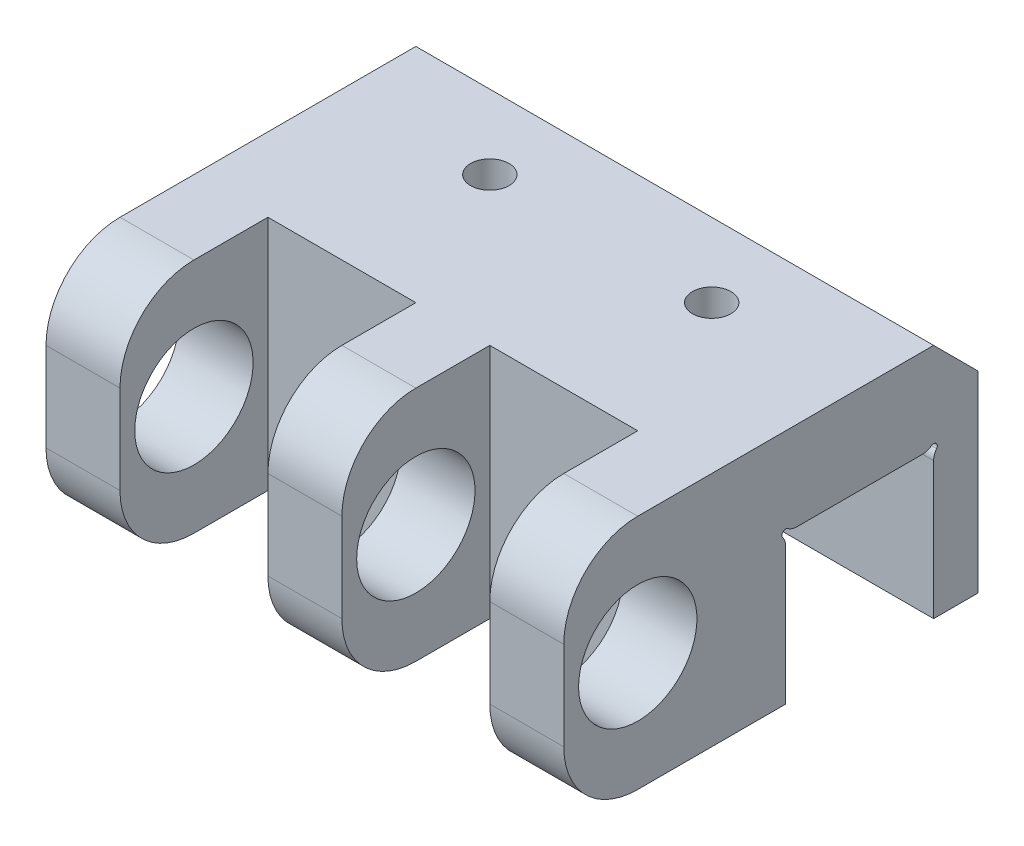
ISO-10303-21;
HEADER;
FILE_DESCRIPTION(('STEP AP214'),'2;1');
FILE_NAME('part.step','',(''),(''),'','','');
FILE_SCHEMA(('AUTOMOTIVE_DESIGN { 1 0 10303 214 1 1 1 1 }'));
ENDSEC;
DATA;
#1=APPLICATION_CONTEXT('core data for automotive mechanical design processes');
#2=APPLICATION_PROTOCOL_DEFINITION('international standard','automotive_design',2000,#1);
#3=PRODUCT_CONTEXT('',#1,'mechanical');
#4=PRODUCT('Part','Part','',(#3));
#5=PRODUCT_RELATED_PRODUCT_CATEGORY('part','',(#4));
#6=PRODUCT_DEFINITION_FORMATION('','',#4);
#7=PRODUCT_DEFINITION_CONTEXT('part definition',#1,'design');
#8=PRODUCT_DEFINITION('design','',#6,#7);
#9=PRODUCT_DEFINITION_SHAPE('','',#8);
#10=(LENGTH_UNIT() NAMED_UNIT(*) SI_UNIT(.MILLI.,.METRE.));
#11=(NAMED_UNIT(*) PLANE_ANGLE_UNIT() SI_UNIT($,.RADIAN.));
#12=(NAMED_UNIT(*) SI_UNIT($,.STERADIAN.) SOLID_ANGLE_UNIT());
#13=UNCERTAINTY_MEASURE_WITH_UNIT(LENGTH_MEASURE(1.E-05),#10,'distance_accuracy_value','');
#14=(GEOMETRIC_REPRESENTATION_CONTEXT(3) GLOBAL_UNCERTAINTY_ASSIGNED_CONTEXT((#13)) GLOBAL_UNIT_ASSIGNED_CONTEXT((#10,
#11,#12)) REPRESENTATION_CONTEXT('',''));
#15=CARTESIAN_POINT('',(0.,0.,0.));
#16=DIRECTION('',(0.,0.,1.));
#17=DIRECTION('',(1.,0.,0.));
#18=AXIS2_PLACEMENT_3D('',#15,#16,#17);
#19=CARTESIAN_POINT('',(70.,20.,-26.));
#20=DIRECTION('',(0.,1.,0.));
#21=DIRECTION('',(0.,0.,1.));
#22=AXIS2_PLACEMENT_3D('',#19,#20,#21);
#23=PLANE('',#22);
#24=CARTESIAN_POINT('',(20.,20.,-10.));
#25=DIRECTION('',(0.,-1.,0.));
#26=DIRECTION('',(0.,0.,-1.));
#27=AXIS2_PLACEMENT_3D('',#24,#25,#26);
#28=CIRCLE('',#27,2.6);
#29=CARTESIAN_POINT('',(20.,20.,-12.6));
#30=VERTEX_POINT('',#29);
#31=EDGE_CURVE('E1016',#30,#30,#28,.T.);
#32=ORIENTED_EDGE('',*,*,#31,.F.);
#33=EDGE_LOOP('',(#32));
#34=FACE_BOUND('',#33,.T.);
#35=CARTESIAN_POINT('',(50.,20.,-10.));
#36=DIRECTION('',(0.,-1.,0.));
#37=DIRECTION('',(0.,0.,-1.));
#38=AXIS2_PLACEMENT_3D('',#35,#36,#37);
#39=CIRCLE('',#38,2.6);
#40=CARTESIAN_POINT('',(50.,20.,-12.6));
#41=VERTEX_POINT('',#40);
#42=EDGE_CURVE('E1012',#41,#41,#39,.T.);
#43=ORIENTED_EDGE('',*,*,#42,.F.);
#44=EDGE_LOOP('',(#43));
#45=FACE_BOUND('',#44,.T.);
#46=DIRECTION('',(0.,0.,1.));
#47=VECTOR('',#46,1.);
#48=CARTESIAN_POINT('',(70.,20.,-26.));
#49=LINE('',#48,#47);
#50=CARTESIAN_POINT('',(70.,20.,-18.5));
#51=VERTEX_POINT('',#50);
#52=CARTESIAN_POINT('',(70.,20.,-1.50000000000001));
#53=VERTEX_POINT('',#52);
#54=EDGE_CURVE('E293',#51,#53,#49,.T.);
#55=ORIENTED_EDGE('',*,*,#54,.T.);
#56=DIRECTION('',(-1.,0.,0.));
#57=VECTOR('',#56,1.);
#58=CARTESIAN_POINT('',(70.,20.,-1.5));
#59=LINE('',#58,#57);
#60=CARTESIAN_POINT('',(0.,20.,-1.50000000000001));
#61=VERTEX_POINT('',#60);
#62=EDGE_CURVE('E433',#53,#61,#59,.T.);
#63=ORIENTED_EDGE('',*,*,#62,.T.);
#64=DIRECTION('',(0.,0.,1.));
#65=VECTOR('',#64,1.);
#66=CARTESIAN_POINT('',(0.,20.,-26.));
#67=LINE('',#66,#65);
#68=CARTESIAN_POINT('',(0.,20.,-18.5));
#69=VERTEX_POINT('',#68);
#70=EDGE_CURVE('E251',#69,#61,#67,.T.);
#71=ORIENTED_EDGE('',*,*,#70,.F.);
#72=DIRECTION('',(-1.,0.,0.));
#73=VECTOR('',#72,1.);
#74=CARTESIAN_POINT('',(70.,20.,-18.5));
#75=LINE('',#74,#73);
#76=EDGE_CURVE('E429',#69,#51,#75,.F.);
#77=ORIENTED_EDGE('',*,*,#76,.T.);
#78=EDGE_LOOP('',(#55,#63,#71,#77));
#79=FACE_BOUND('',#78,.T.);
#80=ADVANCED_FACE('F47',(#34,#45,#79),#23,.F.);
#81=CARTESIAN_POINT('',(0.,0.,10.));
#82=DIRECTION('',(0.,0.,-1.));
#83=DIRECTION('',(-1.,0.,0.));
#84=AXIS2_PLACEMENT_3D('',#81,#82,#83);
#85=PLANE('',#84);
#86=DIRECTION('',(0.,-1.,0.));
#87=VECTOR('',#86,1.);
#88=CARTESIAN_POINT('',(60.,32.,10.));
#89=LINE('',#88,#87);
#90=CARTESIAN_POINT('',(60.,32.,10.));
#91=VERTEX_POINT('',#90);
#92=CARTESIAN_POINT('',(60.,0.,10.));
#93=VERTEX_POINT('',#92);
#94=EDGE_CURVE('E304',#91,#93,#89,.T.);
#95=ORIENTED_EDGE('',*,*,#94,.F.);
#96=DIRECTION('',(-1.,0.,0.));
#97=VECTOR('',#96,1.);
#98=CARTESIAN_POINT('',(0.,32.,10.));
#99=LINE('',#98,#97);
#100=CARTESIAN_POINT('',(40.,32.,10.));
#101=VERTEX_POINT('',#100);
#102=EDGE_CURVE('E368',#91,#101,#99,.T.);
#103=ORIENTED_EDGE('',*,*,#102,.T.);
#104=DIRECTION('',(0.,1.,0.));
#105=VECTOR('',#104,1.);
#106=CARTESIAN_POINT('',(40.,0.,10.));
#107=LINE('',#106,#105);
#108=CARTESIAN_POINT('',(40.,0.,10.));
#109=VERTEX_POINT('',#108);
#110=EDGE_CURVE('E328',#109,#101,#107,.T.);
#111=ORIENTED_EDGE('',*,*,#110,.F.);
#112=DIRECTION('',(1.,0.,0.));
#113=VECTOR('',#112,1.);
#114=CARTESIAN_POINT('',(0.,0.,10.));
#115=LINE('',#114,#113);
#116=EDGE_CURVE('E367',#109,#93,#115,.T.);
#117=ORIENTED_EDGE('',*,*,#116,.T.);
#118=EDGE_LOOP('',(#95,#103,#111,#117));
#119=FACE_BOUND('',#118,.T.);
#120=ADVANCED_FACE('F550',(#119),#85,.F.);
#121=DIRECTION('',(0.,-1.,0.));
#122=VECTOR('',#121,1.);
#123=CARTESIAN_POINT('',(30.,0.,10.));
#124=LINE('',#123,#122);
#125=CARTESIAN_POINT('',(30.,32.,10.));
#126=VERTEX_POINT('',#125);
#127=CARTESIAN_POINT('',(30.,0.,10.));
#128=VERTEX_POINT('',#127);
#129=EDGE_CURVE('E332',#126,#128,#124,.T.);
#130=ORIENTED_EDGE('',*,*,#129,.F.);
#131=CARTESIAN_POINT('',(10.,32.,10.));
#132=VERTEX_POINT('',#131);
#133=EDGE_CURVE('E366',#126,#132,#99,.T.);
#134=ORIENTED_EDGE('',*,*,#133,.T.);
#135=DIRECTION('',(0.,1.,0.));
#136=VECTOR('',#135,1.);
#137=CARTESIAN_POINT('',(10.,32.,10.));
#138=LINE('',#137,#136);
#139=CARTESIAN_POINT('',(10.,0.,10.));
#140=VERTEX_POINT('',#139);
#141=EDGE_CURVE('E337',#140,#132,#138,.T.);
#142=ORIENTED_EDGE('',*,*,#141,.F.);
#143=EDGE_CURVE('E362',#140,#128,#115,.T.);
#144=ORIENTED_EDGE('',*,*,#143,.T.);
#145=EDGE_LOOP('',(#130,#134,#142,#144));
#146=FACE_BOUND('',#145,.T.);
#147=ADVANCED_FACE('F590',(#146),#85,.F.);
#148=CARTESIAN_POINT('',(0.,0.,10.));
#149=DIRECTION('',(1.,0.,0.));
#150=DIRECTION('',(0.,0.,-1.));
#151=AXIS2_PLACEMENT_3D('',#148,#149,#150);
#152=PLANE('',#151);
#153=CARTESIAN_POINT('',(0.,16.,20.));
#154=DIRECTION('',(-1.,0.,0.));
#155=DIRECTION('',(0.,0.,1.));
#156=AXIS2_PLACEMENT_3D('',#153,#154,#155);
#157=CIRCLE('',#156,8.);
#158=CARTESIAN_POINT('',(0.,16.,28.));
#159=VERTEX_POINT('',#158);
#160=EDGE_CURVE('E1001',#159,#159,#157,.T.);
#161=ORIENTED_EDGE('',*,*,#160,.F.);
#162=EDGE_LOOP('',(#161));
#163=FACE_BOUND('',#162,.T.);
#164=DIRECTION('',(0.,0.,-1.));
#165=VECTOR('',#164,1.);
#166=CARTESIAN_POINT('',(0.,32.,10.));
#167=LINE('',#166,#165);
#168=CARTESIAN_POINT('',(0.,32.,20.));
#169=VERTEX_POINT('',#168);
#170=CARTESIAN_POINT('',(0.,32.,-20.));
#171=VERTEX_POINT('',#170);
#172=EDGE_CURVE('E372',#169,#171,#167,.T.);
#173=ORIENTED_EDGE('',*,*,#172,.T.);
#174=DIRECTION('',(0.,-0.707106781186546,-0.707106781186549));
#175=VECTOR('',#174,1.);
#176=CARTESIAN_POINT('',(0.,26.,-26.));
#177=LINE('',#176,#175);
#178=CARTESIAN_POINT('',(0.,26.,-26.));
#179=VERTEX_POINT('',#178);
#180=EDGE_CURVE('E11',#171,#179,#177,.T.);
#181=ORIENTED_EDGE('',*,*,#180,.T.);
#182=DIRECTION('',(0.,1.,0.));
#183=VECTOR('',#182,1.);
#184=CARTESIAN_POINT('',(0.,32.,-26.));
#185=LINE('',#184,#183);
#186=CARTESIAN_POINT('',(0.,0.,-26.));
#187=VERTEX_POINT('',#186);
#188=EDGE_CURVE('E240',#187,#179,#185,.T.);
#189=ORIENTED_EDGE('',*,*,#188,.F.);
#190=DIRECTION('',(0.,0.,-1.));
#191=VECTOR('',#190,1.);
#192=CARTESIAN_POINT('',(0.,0.,-26.));
#193=LINE('',#192,#191);
#194=CARTESIAN_POINT('',(0.,0.,-20.));
#195=VERTEX_POINT('',#194);
#196=EDGE_CURVE('E245',#195,#187,#193,.T.);
#197=ORIENTED_EDGE('',*,*,#196,.F.);
#198=DIRECTION('',(0.,1.,0.));
#199=VECTOR('',#198,1.);
#200=CARTESIAN_POINT('',(0.,0.,-20.));
#201=LINE('',#200,#199);
#202=CARTESIAN_POINT('',(0.,18.5,-20.));
#203=VERTEX_POINT('',#202);
#204=EDGE_CURVE('E281',#195,#203,#201,.T.);
#205=ORIENTED_EDGE('',*,*,#204,.T.);
#206=CARTESIAN_POINT('',(0.,18.5,-22.));
#207=DIRECTION('',(1.,0.,0.));
#208=DIRECTION('',(0.,0.,-1.));
#209=AXIS2_PLACEMENT_3D('',#206,#207,#208);
#210=CIRCLE('',#209,2.);
#211=CARTESIAN_POINT('',(0.,19.7,-20.4));
#212=VERTEX_POINT('',#211);
#213=EDGE_CURVE('E402',#203,#212,#210,.F.);
#214=ORIENTED_EDGE('',*,*,#213,.T.);
#215=CARTESIAN_POINT('',(0.,20.,-20.));
#216=DIRECTION('',(-1.,0.,0.));
#217=DIRECTION('',(0.,0.,1.));
#218=AXIS2_PLACEMENT_3D('',#215,#216,#217);
#219=CIRCLE('',#218,0.499999999999999);
#220=CARTESIAN_POINT('',(0.,20.4,-19.7));
#221=VERTEX_POINT('',#220);
#222=EDGE_CURVE('E271',#221,#212,#219,.T.);
#223=ORIENTED_EDGE('',*,*,#222,.F.);
#224=CARTESIAN_POINT('',(0.,22.,-18.5));
#225=DIRECTION('',(1.,0.,0.));
#226=DIRECTION('',(0.,0.,-1.));
#227=AXIS2_PLACEMENT_3D('',#224,#225,#226);
#228=CIRCLE('',#227,2.);
#229=EDGE_CURVE('E405',#221,#69,#228,.F.);
#230=ORIENTED_EDGE('',*,*,#229,.T.);
#231=ORIENTED_EDGE('',*,*,#70,.T.);
#232=CARTESIAN_POINT('',(0.,22.,-1.5));
#233=DIRECTION('',(1.,0.,0.));
#234=DIRECTION('',(0.,0.,-1.));
#235=AXIS2_PLACEMENT_3D('',#232,#233,#234);
#236=CIRCLE('',#235,2.);
#237=CARTESIAN_POINT('',(0.,20.4,-0.299999999999999));
#238=VERTEX_POINT('',#237);
#239=EDGE_CURVE('E408',#61,#238,#236,.F.);
#240=ORIENTED_EDGE('',*,*,#239,.T.);
#241=CARTESIAN_POINT('',(0.,20.,0.));
#242=DIRECTION('',(-1.,0.,0.));
#243=DIRECTION('',(0.,0.,1.));
#244=AXIS2_PLACEMENT_3D('',#241,#242,#243);
#245=CIRCLE('',#244,0.5);
#246=CARTESIAN_POINT('',(0.,19.7,0.399999999999999));
#247=VERTEX_POINT('',#246);
#248=EDGE_CURVE('E986',#247,#238,#245,.T.);
#249=ORIENTED_EDGE('',*,*,#248,.F.);
#250=CARTESIAN_POINT('',(0.,18.5,2.));
#251=DIRECTION('',(1.,0.,0.));
#252=DIRECTION('',(0.,0.,-1.));
#253=AXIS2_PLACEMENT_3D('',#250,#251,#252);
#254=CIRCLE('',#253,2.);
#255=CARTESIAN_POINT('',(0.,18.5,0.));
#256=VERTEX_POINT('',#255);
#257=EDGE_CURVE('E411',#247,#256,#254,.F.);
#258=ORIENTED_EDGE('',*,*,#257,.T.);
#259=DIRECTION('',(0.,-1.,0.));
#260=VECTOR('',#259,1.);
#261=CARTESIAN_POINT('',(0.,0.,0.));
#262=LINE('',#261,#260);
#263=CARTESIAN_POINT('',(0.,0.,0.));
#264=VERTEX_POINT('',#263);
#265=EDGE_CURVE('E361',#256,#264,#262,.T.);
#266=ORIENTED_EDGE('',*,*,#265,.T.);
#267=DIRECTION('',(0.,0.,-1.));
#268=VECTOR('',#267,1.);
#269=CARTESIAN_POINT('',(0.,0.,10.));
#270=LINE('',#269,#268);
#271=CARTESIAN_POINT('',(0.,0.,20.));
#272=VERTEX_POINT('',#271);
#273=EDGE_CURVE('E392',#272,#264,#270,.T.);
#274=ORIENTED_EDGE('',*,*,#273,.F.);
#275=CARTESIAN_POINT('',(0.,10.,20.));
#276=DIRECTION('',(1.,0.,0.));
#277=DIRECTION('',(0.,0.,-1.));
#278=AXIS2_PLACEMENT_3D('',#275,#276,#277);
#279=CIRCLE('',#278,10.);
#280=CARTESIAN_POINT('',(0.,10.,30.));
#281=VERTEX_POINT('',#280);
#282=EDGE_CURVE('E479',#272,#281,#279,.F.);
#283=ORIENTED_EDGE('',*,*,#282,.T.);
#284=DIRECTION('',(0.,-1.,0.));
#285=VECTOR('',#284,1.);
#286=CARTESIAN_POINT('',(0.,32.,30.));
#287=LINE('',#286,#285);
#288=CARTESIAN_POINT('',(0.,22.,30.));
#289=VERTEX_POINT('',#288);
#290=EDGE_CURVE('E344',#289,#281,#287,.T.);
#291=ORIENTED_EDGE('',*,*,#290,.F.);
#292=CARTESIAN_POINT('',(0.,22.,20.));
#293=DIRECTION('',(1.,0.,0.));
#294=DIRECTION('',(0.,0.,-1.));
#295=AXIS2_PLACEMENT_3D('',#292,#293,#294);
#296=CIRCLE('',#295,10.);
#297=EDGE_CURVE('E476',#289,#169,#296,.F.);
#298=ORIENTED_EDGE('',*,*,#297,.T.);
#299=EDGE_LOOP('',(#173,#181,#189,#197,#205,#214,#223,#230,#231,#240,#249,#258,#266,#274,#283,
#291,#298));
#300=FACE_BOUND('',#299,.T.);
#301=ADVANCED_FACE('F242',(#163,#300),#152,.F.);
#302=CARTESIAN_POINT('',(0.,0.,10.));
#303=DIRECTION('',(0.,1.,0.));
#304=DIRECTION('',(0.,0.,1.));
#305=AXIS2_PLACEMENT_3D('',#302,#303,#304);
#306=PLANE('',#305);
#307=DIRECTION('',(0.,0.,-1.));
#308=VECTOR('',#307,1.);
#309=CARTESIAN_POINT('',(10.,0.,30.));
#310=LINE('',#309,#308);
#311=CARTESIAN_POINT('',(10.,0.,20.));
#312=VERTEX_POINT('',#311);
#313=EDGE_CURVE('E358',#312,#140,#310,.T.);
#314=ORIENTED_EDGE('',*,*,#313,.F.);
#315=DIRECTION('',(1.,0.,0.));
#316=VECTOR('',#315,1.);
#317=CARTESIAN_POINT('',(0.,0.,20.));
#318=LINE('',#317,#316);
#319=EDGE_CURVE('E473',#312,#272,#318,.F.);
#320=ORIENTED_EDGE('',*,*,#319,.T.);
#321=ORIENTED_EDGE('',*,*,#273,.T.);
#322=DIRECTION('',(1.,0.,0.));
#323=VECTOR('',#322,1.);
#324=CARTESIAN_POINT('',(0.,0.,0.));
#325=LINE('',#324,#323);
#326=CARTESIAN_POINT('',(70.,0.,0.));
#327=VERTEX_POINT('',#326);
#328=EDGE_CURVE('E376',#264,#327,#325,.T.);
#329=ORIENTED_EDGE('',*,*,#328,.T.);
#330=DIRECTION('',(0.,0.,-1.));
#331=VECTOR('',#330,1.);
#332=CARTESIAN_POINT('',(70.,0.,10.));
#333=LINE('',#332,#331);
#334=CARTESIAN_POINT('',(70.,0.,20.));
#335=VERTEX_POINT('',#334);
#336=EDGE_CURVE('E389',#335,#327,#333,.T.);
#337=ORIENTED_EDGE('',*,*,#336,.F.);
#338=DIRECTION('',(1.,0.,0.));
#339=VECTOR('',#338,1.);
#340=CARTESIAN_POINT('',(0.,0.,20.));
#341=LINE('',#340,#339);
#342=CARTESIAN_POINT('',(60.,0.,20.));
#343=VERTEX_POINT('',#342);
#344=EDGE_CURVE('E467',#335,#343,#341,.F.);
#345=ORIENTED_EDGE('',*,*,#344,.T.);
#346=DIRECTION('',(0.,0.,-1.));
#347=VECTOR('',#346,1.);
#348=CARTESIAN_POINT('',(60.,0.,30.));
#349=LINE('',#348,#347);
#350=EDGE_CURVE('E300',#343,#93,#349,.T.);
#351=ORIENTED_EDGE('',*,*,#350,.T.);
#352=ORIENTED_EDGE('',*,*,#116,.F.);
#353=DIRECTION('',(0.,0.,-1.));
#354=VECTOR('',#353,1.);
#355=CARTESIAN_POINT('',(40.,0.,30.));
#356=LINE('',#355,#354);
#357=CARTESIAN_POINT('',(40.,0.,20.));
#358=VERTEX_POINT('',#357);
#359=EDGE_CURVE('E318',#358,#109,#356,.T.);
#360=ORIENTED_EDGE('',*,*,#359,.F.);
#361=DIRECTION('',(1.,0.,0.));
#362=VECTOR('',#361,1.);
#363=CARTESIAN_POINT('',(0.,0.,20.));
#364=LINE('',#363,#362);
#365=CARTESIAN_POINT('',(30.,0.,20.));
#366=VERTEX_POINT('',#365);
#367=EDGE_CURVE('E470',#358,#366,#364,.F.);
#368=ORIENTED_EDGE('',*,*,#367,.T.);
#369=DIRECTION('',(0.,0.,-1.));
#370=VECTOR('',#369,1.);
#371=CARTESIAN_POINT('',(30.,0.,30.));
#372=LINE('',#371,#370);
#373=EDGE_CURVE('E308',#366,#128,#372,.T.);
#374=ORIENTED_EDGE('',*,*,#373,.T.);
#375=ORIENTED_EDGE('',*,*,#143,.F.);
#376=EDGE_LOOP('',(#314,#320,#321,#329,#337,#345,#351,#352,#360,#368,#374,#375));
#377=FACE_BOUND('',#376,.T.);
#378=ADVANCED_FACE('F569',(#377),#306,.F.);
#379=CARTESIAN_POINT('',(70.,0.,10.));
#380=DIRECTION('',(-1.,0.,0.));
#381=DIRECTION('',(0.,0.,1.));
#382=AXIS2_PLACEMENT_3D('',#379,#380,#381);
#383=PLANE('',#382);
#384=CARTESIAN_POINT('',(70.,16.,20.));
#385=DIRECTION('',(-1.,0.,0.));
#386=DIRECTION('',(0.,0.,1.));
#387=AXIS2_PLACEMENT_3D('',#384,#385,#386);
#388=CIRCLE('',#387,8.);
#389=CARTESIAN_POINT('',(70.,16.,28.));
#390=VERTEX_POINT('',#389);
#391=EDGE_CURVE('E453',#390,#390,#388,.T.);
#392=ORIENTED_EDGE('',*,*,#391,.T.);
#393=EDGE_LOOP('',(#392));
#394=FACE_BOUND('',#393,.T.);
#395=DIRECTION('',(0.,-1.,0.));
#396=VECTOR('',#395,1.);
#397=CARTESIAN_POINT('',(70.,32.,-26.));
#398=LINE('',#397,#396);
#399=CARTESIAN_POINT('',(70.,26.,-26.));
#400=VERTEX_POINT('',#399);
#401=CARTESIAN_POINT('',(70.,0.,-26.));
#402=VERTEX_POINT('',#401);
#403=EDGE_CURVE('E252',#400,#402,#398,.T.);
#404=ORIENTED_EDGE('',*,*,#403,.F.);
#405=DIRECTION('',(0.,0.707106781186546,0.707106781186549));
#406=VECTOR('',#405,1.);
#407=CARTESIAN_POINT('',(70.,26.,-26.));
#408=LINE('',#407,#406);
#409=CARTESIAN_POINT('',(70.,32.,-20.));
#410=VERTEX_POINT('',#409);
#411=EDGE_CURVE('E71',#400,#410,#408,.T.);
#412=ORIENTED_EDGE('',*,*,#411,.T.);
#413=DIRECTION('',(0.,0.,-1.));
#414=VECTOR('',#413,1.);
#415=CARTESIAN_POINT('',(70.,32.,10.));
#416=LINE('',#415,#414);
#417=CARTESIAN_POINT('',(70.,32.,20.));
#418=VERTEX_POINT('',#417);
#419=EDGE_CURVE('E386',#418,#410,#416,.T.);
#420=ORIENTED_EDGE('',*,*,#419,.F.);
#421=CARTESIAN_POINT('',(70.,22.,20.));
#422=DIRECTION('',(-1.,0.,0.));
#423=DIRECTION('',(0.,0.,1.));
#424=AXIS2_PLACEMENT_3D('',#421,#422,#423);
#425=CIRCLE('',#424,10.);
#426=CARTESIAN_POINT('',(70.,22.,30.));
#427=VERTEX_POINT('',#426);
#428=EDGE_CURVE('E510',#418,#427,#425,.F.);
#429=ORIENTED_EDGE('',*,*,#428,.T.);
#430=DIRECTION('',(0.,1.,0.));
#431=VECTOR('',#430,1.);
#432=CARTESIAN_POINT('',(70.,32.,30.));
#433=LINE('',#432,#431);
#434=CARTESIAN_POINT('',(70.,10.,30.));
#435=VERTEX_POINT('',#434);
#436=EDGE_CURVE('E309',#435,#427,#433,.T.);
#437=ORIENTED_EDGE('',*,*,#436,.F.);
#438=CARTESIAN_POINT('',(70.,10.,20.));
#439=DIRECTION('',(-1.,0.,0.));
#440=DIRECTION('',(0.,0.,1.));
#441=AXIS2_PLACEMENT_3D('',#438,#439,#440);
#442=CIRCLE('',#441,10.);
#443=EDGE_CURVE('E513',#435,#335,#442,.F.);
#444=ORIENTED_EDGE('',*,*,#443,.T.);
#445=ORIENTED_EDGE('',*,*,#336,.T.);
#446=DIRECTION('',(0.,1.,0.));
#447=VECTOR('',#446,1.);
#448=CARTESIAN_POINT('',(70.,0.,0.));
#449=LINE('',#448,#447);
#450=CARTESIAN_POINT('',(70.,18.5,0.));
#451=VERTEX_POINT('',#450);
#452=EDGE_CURVE('E380',#327,#451,#449,.T.);
#453=ORIENTED_EDGE('',*,*,#452,.T.);
#454=CARTESIAN_POINT('',(70.,18.5,2.));
#455=DIRECTION('',(-1.,0.,0.));
#456=DIRECTION('',(0.,0.,1.));
#457=AXIS2_PLACEMENT_3D('',#454,#455,#456);
#458=CIRCLE('',#457,2.);
#459=CARTESIAN_POINT('',(70.,19.7,0.399999999999999));
#460=VERTEX_POINT('',#459);
#461=EDGE_CURVE('E426',#451,#460,#458,.F.);
#462=ORIENTED_EDGE('',*,*,#461,.T.);
#463=CARTESIAN_POINT('',(70.,20.,0.));
#464=DIRECTION('',(-1.,0.,0.));
#465=DIRECTION('',(0.,0.,1.));
#466=AXIS2_PLACEMENT_3D('',#463,#464,#465);
#467=CIRCLE('',#466,0.5);
#468=CARTESIAN_POINT('',(70.,20.4,-0.299999999999999));
#469=VERTEX_POINT('',#468);
#470=EDGE_CURVE('E274',#460,#469,#467,.T.);
#471=ORIENTED_EDGE('',*,*,#470,.T.);
#472=CARTESIAN_POINT('',(70.,22.,-1.5));
#473=DIRECTION('',(-1.,0.,0.));
#474=DIRECTION('',(0.,0.,1.));
#475=AXIS2_PLACEMENT_3D('',#472,#473,#474);
#476=CIRCLE('',#475,2.);
#477=EDGE_CURVE('E423',#469,#53,#476,.F.);
#478=ORIENTED_EDGE('',*,*,#477,.T.);
#479=ORIENTED_EDGE('',*,*,#54,.F.);
#480=CARTESIAN_POINT('',(70.,22.,-18.5));
#481=DIRECTION('',(-1.,0.,0.));
#482=DIRECTION('',(0.,0.,1.));
#483=AXIS2_PLACEMENT_3D('',#480,#481,#482);
#484=CIRCLE('',#483,2.);
#485=CARTESIAN_POINT('',(70.,20.4,-19.7));
#486=VERTEX_POINT('',#485);
#487=EDGE_CURVE('E420',#51,#486,#484,.F.);
#488=ORIENTED_EDGE('',*,*,#487,.T.);
#489=CARTESIAN_POINT('',(70.,20.,-20.));
#490=DIRECTION('',(-1.,0.,0.));
#491=DIRECTION('',(0.,0.,1.));
#492=AXIS2_PLACEMENT_3D('',#489,#490,#491);
#493=CIRCLE('',#492,0.499999999999999);
#494=CARTESIAN_POINT('',(70.,19.7,-20.4));
#495=VERTEX_POINT('',#494);
#496=EDGE_CURVE('E267',#486,#495,#493,.T.);
#497=ORIENTED_EDGE('',*,*,#496,.T.);
#498=CARTESIAN_POINT('',(70.,18.5,-22.));
#499=DIRECTION('',(-1.,0.,0.));
#500=DIRECTION('',(0.,0.,1.));
#501=AXIS2_PLACEMENT_3D('',#498,#499,#500);
#502=CIRCLE('',#501,2.);
#503=CARTESIAN_POINT('',(70.,18.5,-20.));
#504=VERTEX_POINT('',#503);
#505=EDGE_CURVE('E417',#495,#504,#502,.F.);
#506=ORIENTED_EDGE('',*,*,#505,.T.);
#507=DIRECTION('',(0.,1.,0.));
#508=VECTOR('',#507,1.);
#509=CARTESIAN_POINT('',(70.,0.,-20.));
#510=LINE('',#509,#508);
#511=CARTESIAN_POINT('',(70.,0.,-20.));
#512=VERTEX_POINT('',#511);
#513=EDGE_CURVE('E284',#512,#504,#510,.T.);
#514=ORIENTED_EDGE('',*,*,#513,.F.);
#515=DIRECTION('',(0.,0.,1.));
#516=VECTOR('',#515,1.);
#517=CARTESIAN_POINT('',(70.,0.,-26.));
#518=LINE('',#517,#516);
#519=EDGE_CURVE('E260',#402,#512,#518,.T.);
#520=ORIENTED_EDGE('',*,*,#519,.F.);
#521=EDGE_LOOP('',(#404,#412,#420,#429,#437,#444,#445,#453,#462,#471,#478,#479,#488,#497,#506,
#514,#520));
#522=FACE_BOUND('',#521,.T.);
#523=ADVANCED_FACE('F768',(#394,#522),#383,.F.);
#524=CARTESIAN_POINT('',(0.,32.,10.));
#525=DIRECTION('',(0.,-1.,0.));
#526=DIRECTION('',(0.,0.,-1.));
#527=AXIS2_PLACEMENT_3D('',#524,#525,#526);
#528=PLANE('',#527);
#529=CARTESIAN_POINT('',(20.,32.,-10.));
#530=DIRECTION('',(0.,-1.,0.));
#531=DIRECTION('',(0.,0.,-1.));
#532=AXIS2_PLACEMENT_3D('',#529,#530,#531);
#533=CIRCLE('',#532,2.6);
#534=CARTESIAN_POINT('',(20.,32.,-12.6));
#535=VERTEX_POINT('',#534);
#536=EDGE_CURVE('E1005',#535,#535,#533,.T.);
#537=ORIENTED_EDGE('',*,*,#536,.T.);
#538=EDGE_LOOP('',(#537));
#539=FACE_BOUND('',#538,.T.);
#540=CARTESIAN_POINT('',(50.,32.,-10.));
#541=DIRECTION('',(0.,-1.,0.));
#542=DIRECTION('',(0.,0.,-1.));
#543=AXIS2_PLACEMENT_3D('',#540,#541,#542);
#544=CIRCLE('',#543,2.6);
#545=CARTESIAN_POINT('',(50.,32.,-12.6));
#546=VERTEX_POINT('',#545);
#547=EDGE_CURVE('E536',#546,#546,#544,.T.);
#548=ORIENTED_EDGE('',*,*,#547,.T.);
#549=EDGE_LOOP('',(#548));
#550=FACE_BOUND('',#549,.T.);
#551=ORIENTED_EDGE('',*,*,#419,.T.);
#552=DIRECTION('',(-1.,0.,0.));
#553=VECTOR('',#552,1.);
#554=CARTESIAN_POINT('',(0.,32.,-20.));
#555=LINE('',#554,#553);
#556=EDGE_CURVE('E57',#410,#171,#555,.T.);
#557=ORIENTED_EDGE('',*,*,#556,.T.);
#558=ORIENTED_EDGE('',*,*,#172,.F.);
#559=DIRECTION('',(-1.,0.,0.));
#560=VECTOR('',#559,1.);
#561=CARTESIAN_POINT('',(10.,32.,20.));
#562=LINE('',#561,#560);
#563=CARTESIAN_POINT('',(10.,32.,20.));
#564=VERTEX_POINT('',#563);
#565=EDGE_CURVE('E522',#169,#564,#562,.F.);
#566=ORIENTED_EDGE('',*,*,#565,.T.);
#567=DIRECTION('',(0.,0.,-1.));
#568=VECTOR('',#567,1.);
#569=CARTESIAN_POINT('',(10.,32.,30.));
#570=LINE('',#569,#568);
#571=EDGE_CURVE('E352',#564,#132,#570,.T.);
#572=ORIENTED_EDGE('',*,*,#571,.T.);
#573=ORIENTED_EDGE('',*,*,#133,.F.);
#574=DIRECTION('',(0.,0.,-1.));
#575=VECTOR('',#574,1.);
#576=CARTESIAN_POINT('',(30.,32.,30.));
#577=LINE('',#576,#575);
#578=CARTESIAN_POINT('',(30.,32.,20.));
#579=VERTEX_POINT('',#578);
#580=EDGE_CURVE('E324',#579,#126,#577,.T.);
#581=ORIENTED_EDGE('',*,*,#580,.F.);
#582=DIRECTION('',(-1.,0.,0.));
#583=VECTOR('',#582,1.);
#584=CARTESIAN_POINT('',(0.,32.,20.));
#585=LINE('',#584,#583);
#586=CARTESIAN_POINT('',(40.,32.,20.));
#587=VERTEX_POINT('',#586);
#588=EDGE_CURVE('E525',#579,#587,#585,.F.);
#589=ORIENTED_EDGE('',*,*,#588,.T.);
#590=DIRECTION('',(0.,0.,-1.));
#591=VECTOR('',#590,1.);
#592=CARTESIAN_POINT('',(40.,32.,30.));
#593=LINE('',#592,#591);
#594=EDGE_CURVE('E321',#587,#101,#593,.T.);
#595=ORIENTED_EDGE('',*,*,#594,.T.);
#596=ORIENTED_EDGE('',*,*,#102,.F.);
#597=DIRECTION('',(0.,0.,-1.));
#598=VECTOR('',#597,1.);
#599=CARTESIAN_POINT('',(60.,32.,30.));
#600=LINE('',#599,#598);
#601=CARTESIAN_POINT('',(60.,32.,20.));
#602=VERTEX_POINT('',#601);
#603=EDGE_CURVE('E297',#602,#91,#600,.T.);
#604=ORIENTED_EDGE('',*,*,#603,.F.);
#605=DIRECTION('',(-1.,0.,0.));
#606=VECTOR('',#605,1.);
#607=CARTESIAN_POINT('',(0.,32.,20.));
#608=LINE('',#607,#606);
#609=EDGE_CURVE('E528',#602,#418,#608,.F.);
#610=ORIENTED_EDGE('',*,*,#609,.T.);
#611=EDGE_LOOP('',(#551,#557,#558,#566,#572,#573,#581,#589,#595,#596,#604,#610));
#612=FACE_BOUND('',#611,.T.);
#613=ADVANCED_FACE('F561',(#539,#550,#612),#528,.F.);
#614=CARTESIAN_POINT('',(0.,0.,0.));
#615=DIRECTION('',(0.,0.,-1.));
#616=DIRECTION('',(-1.,0.,0.));
#617=AXIS2_PLACEMENT_3D('',#614,#615,#616);
#618=PLANE('',#617);
#619=ORIENTED_EDGE('',*,*,#265,.F.);
#620=DIRECTION('',(1.,0.,0.));
#621=VECTOR('',#620,1.);
#622=CARTESIAN_POINT('',(70.,18.5,0.));
#623=LINE('',#622,#621);
#624=EDGE_CURVE('E414',#256,#451,#623,.T.);
#625=ORIENTED_EDGE('',*,*,#624,.T.);
#626=ORIENTED_EDGE('',*,*,#452,.F.);
#627=ORIENTED_EDGE('',*,*,#328,.F.);
#628=EDGE_LOOP('',(#619,#625,#626,#627));
#629=FACE_BOUND('',#628,.T.);
#630=ADVANCED_FACE('F610',(#629),#618,.T.);
#631=CARTESIAN_POINT('',(10.,32.,30.));
#632=DIRECTION('',(-1.,0.,0.));
#633=DIRECTION('',(0.,-1.,0.));
#634=AXIS2_PLACEMENT_3D('',#631,#632,#633);
#635=PLANE('',#634);
#636=CARTESIAN_POINT('',(10.,16.,20.));
#637=DIRECTION('',(-1.,0.,0.));
#638=DIRECTION('',(0.,-1.,0.));
#639=AXIS2_PLACEMENT_3D('',#636,#637,#638);
#640=CIRCLE('',#639,8.);
#641=CARTESIAN_POINT('',(10.,8.,20.));
#642=VERTEX_POINT('',#641);
#643=EDGE_CURVE('E991',#642,#642,#640,.T.);
#644=ORIENTED_EDGE('',*,*,#643,.T.);
#645=EDGE_LOOP('',(#644));
#646=FACE_BOUND('',#645,.T.);
#647=DIRECTION('',(0.,1.,0.));
#648=VECTOR('',#647,1.);
#649=CARTESIAN_POINT('',(10.,32.,30.));
#650=LINE('',#649,#648);
#651=CARTESIAN_POINT('',(10.,10.,30.));
#652=VERTEX_POINT('',#651);
#653=CARTESIAN_POINT('',(10.,22.,30.));
#654=VERTEX_POINT('',#653);
#655=EDGE_CURVE('E348',#652,#654,#650,.T.);
#656=ORIENTED_EDGE('',*,*,#655,.F.);
#657=CARTESIAN_POINT('',(10.,10.,20.));
#658=DIRECTION('',(-1.,0.,0.));
#659=DIRECTION('',(0.,-1.,0.));
#660=AXIS2_PLACEMENT_3D('',#657,#658,#659);
#661=CIRCLE('',#660,10.);
#662=EDGE_CURVE('E464',#652,#312,#661,.F.);
#663=ORIENTED_EDGE('',*,*,#662,.T.);
#664=ORIENTED_EDGE('',*,*,#313,.T.);
#665=ORIENTED_EDGE('',*,*,#141,.T.);
#666=ORIENTED_EDGE('',*,*,#571,.F.);
#667=CARTESIAN_POINT('',(10.,22.,20.));
#668=DIRECTION('',(-1.,0.,0.));
#669=DIRECTION('',(0.,-1.,0.));
#670=AXIS2_PLACEMENT_3D('',#667,#668,#669);
#671=CIRCLE('',#670,10.);
#672=EDGE_CURVE('E461',#564,#654,#671,.F.);
#673=ORIENTED_EDGE('',*,*,#672,.T.);
#674=EDGE_LOOP('',(#656,#663,#664,#665,#666,#673));
#675=FACE_BOUND('',#674,.T.);
#676=ADVANCED_FACE('F608',(#646,#675),#635,.F.);
#677=CARTESIAN_POINT('',(0.,0.,30.));
#678=DIRECTION('',(0.,0.,1.));
#679=DIRECTION('',(1.,0.,0.));
#680=AXIS2_PLACEMENT_3D('',#677,#678,#679);
#681=PLANE('',#680);
#682=ORIENTED_EDGE('',*,*,#290,.T.);
#683=DIRECTION('',(1.,0.,0.));
#684=VECTOR('',#683,1.);
#685=CARTESIAN_POINT('',(10.,10.,30.));
#686=LINE('',#685,#684);
#687=EDGE_CURVE('E457',#281,#652,#686,.T.);
#688=ORIENTED_EDGE('',*,*,#687,.T.);
#689=ORIENTED_EDGE('',*,*,#655,.T.);
#690=DIRECTION('',(-1.,0.,0.));
#691=VECTOR('',#690,1.);
#692=CARTESIAN_POINT('',(0.,22.,30.));
#693=LINE('',#692,#691);
#694=EDGE_CURVE('E447',#654,#289,#693,.T.);
#695=ORIENTED_EDGE('',*,*,#694,.T.);
#696=EDGE_LOOP('',(#682,#688,#689,#695));
#697=FACE_BOUND('',#696,.T.);
#698=ADVANCED_FACE('F601',(#697),#681,.T.);
#699=CARTESIAN_POINT('',(30.,0.,30.));
#700=DIRECTION('',(1.,0.,0.));
#701=DIRECTION('',(0.,0.,-1.));
#702=AXIS2_PLACEMENT_3D('',#699,#700,#701);
#703=PLANE('',#702);
#704=CARTESIAN_POINT('',(30.,16.,20.));
#705=DIRECTION('',(1.,0.,0.));
#706=DIRECTION('',(0.,0.,-1.));
#707=AXIS2_PLACEMENT_3D('',#704,#705,#706);
#708=CIRCLE('',#707,8.);
#709=CARTESIAN_POINT('',(30.,16.,12.));
#710=VERTEX_POINT('',#709);
#711=EDGE_CURVE('E994',#710,#710,#708,.T.);
#712=ORIENTED_EDGE('',*,*,#711,.T.);
#713=EDGE_LOOP('',(#712));
#714=FACE_BOUND('',#713,.T.);
#715=ORIENTED_EDGE('',*,*,#373,.F.);
#716=CARTESIAN_POINT('',(30.,10.,20.));
#717=DIRECTION('',(1.,0.,0.));
#718=DIRECTION('',(0.,0.,-1.));
#719=AXIS2_PLACEMENT_3D('',#716,#717,#718);
#720=CIRCLE('',#719,10.);
#721=CARTESIAN_POINT('',(30.,10.,30.));
#722=VERTEX_POINT('',#721);
#723=EDGE_CURVE('E499',#366,#722,#720,.F.);
#724=ORIENTED_EDGE('',*,*,#723,.T.);
#725=DIRECTION('',(0.,-1.,0.));
#726=VECTOR('',#725,1.);
#727=CARTESIAN_POINT('',(30.,0.,30.));
#728=LINE('',#727,#726);
#729=CARTESIAN_POINT('',(30.,22.,30.));
#730=VERTEX_POINT('',#729);
#731=EDGE_CURVE('E333',#730,#722,#728,.T.);
#732=ORIENTED_EDGE('',*,*,#731,.F.);
#733=CARTESIAN_POINT('',(30.,22.,20.));
#734=DIRECTION('',(1.,0.,0.));
#735=DIRECTION('',(0.,0.,-1.));
#736=AXIS2_PLACEMENT_3D('',#733,#734,#735);
#737=CIRCLE('',#736,10.);
#738=EDGE_CURVE('E496',#730,#579,#737,.F.);
#739=ORIENTED_EDGE('',*,*,#738,.T.);
#740=ORIENTED_EDGE('',*,*,#580,.T.);
#741=ORIENTED_EDGE('',*,*,#129,.T.);
#742=EDGE_LOOP('',(#715,#724,#732,#739,#740,#741));
#743=FACE_BOUND('',#742,.T.);
#744=ADVANCED_FACE('F577',(#714,#743),#703,.F.);
#745=CARTESIAN_POINT('',(40.,0.,30.));
#746=DIRECTION('',(-1.,0.,0.));
#747=DIRECTION('',(0.,0.,1.));
#748=AXIS2_PLACEMENT_3D('',#745,#746,#747);
#749=PLANE('',#748);
#750=CARTESIAN_POINT('',(40.,16.,20.));
#751=DIRECTION('',(-1.,0.,0.));
#752=DIRECTION('',(0.,0.,1.));
#753=AXIS2_PLACEMENT_3D('',#750,#751,#752);
#754=CIRCLE('',#753,8.);
#755=CARTESIAN_POINT('',(40.,16.,28.));
#756=VERTEX_POINT('',#755);
#757=EDGE_CURVE('E452',#756,#756,#754,.T.);
#758=ORIENTED_EDGE('',*,*,#757,.T.);
#759=EDGE_LOOP('',(#758));
#760=FACE_BOUND('',#759,.T.);
#761=DIRECTION('',(0.,1.,0.));
#762=VECTOR('',#761,1.);
#763=CARTESIAN_POINT('',(40.,0.,30.));
#764=LINE('',#763,#762);
#765=CARTESIAN_POINT('',(40.,10.,30.));
#766=VERTEX_POINT('',#765);
#767=CARTESIAN_POINT('',(40.,22.,30.));
#768=VERTEX_POINT('',#767);
#769=EDGE_CURVE('E327',#766,#768,#764,.T.);
#770=ORIENTED_EDGE('',*,*,#769,.F.);
#771=CARTESIAN_POINT('',(40.,10.,20.));
#772=DIRECTION('',(-1.,0.,0.));
#773=DIRECTION('',(0.,0.,1.));
#774=AXIS2_PLACEMENT_3D('',#771,#772,#773);
#775=CIRCLE('',#774,10.);
#776=EDGE_CURVE('E493',#766,#358,#775,.F.);
#777=ORIENTED_EDGE('',*,*,#776,.T.);
#778=ORIENTED_EDGE('',*,*,#359,.T.);
#779=ORIENTED_EDGE('',*,*,#110,.T.);
#780=ORIENTED_EDGE('',*,*,#594,.F.);
#781=CARTESIAN_POINT('',(40.,22.,20.));
#782=DIRECTION('',(-1.,0.,0.));
#783=DIRECTION('',(0.,0.,1.));
#784=AXIS2_PLACEMENT_3D('',#781,#782,#783);
#785=CIRCLE('',#784,10.);
#786=EDGE_CURVE('E490',#587,#768,#785,.F.);
#787=ORIENTED_EDGE('',*,*,#786,.T.);
#788=EDGE_LOOP('',(#770,#777,#778,#779,#780,#787));
#789=FACE_BOUND('',#788,.T.);
#790=ADVANCED_FACE('F565',(#760,#789),#749,.F.);
#791=CARTESIAN_POINT('',(0.,0.,30.));
#792=DIRECTION('',(0.,0.,-1.));
#793=DIRECTION('',(-1.,0.,0.));
#794=AXIS2_PLACEMENT_3D('',#791,#792,#793);
#795=PLANE('',#794);
#796=ORIENTED_EDGE('',*,*,#731,.T.);
#797=DIRECTION('',(1.,0.,0.));
#798=VECTOR('',#797,1.);
#799=CARTESIAN_POINT('',(0.,10.,30.));
#800=LINE('',#799,#798);
#801=EDGE_CURVE('E486',#722,#766,#800,.T.);
#802=ORIENTED_EDGE('',*,*,#801,.T.);
#803=ORIENTED_EDGE('',*,*,#769,.T.);
#804=DIRECTION('',(-1.,0.,0.));
#805=VECTOR('',#804,1.);
#806=CARTESIAN_POINT('',(0.,22.,30.));
#807=LINE('',#806,#805);
#808=EDGE_CURVE('E482',#768,#730,#807,.T.);
#809=ORIENTED_EDGE('',*,*,#808,.T.);
#810=EDGE_LOOP('',(#796,#802,#803,#809));
#811=FACE_BOUND('',#810,.T.);
#812=ADVANCED_FACE('F579',(#811),#795,.F.);
#813=CARTESIAN_POINT('',(60.,32.,30.));
#814=DIRECTION('',(1.,0.,0.));
#815=DIRECTION('',(0.,1.,0.));
#816=AXIS2_PLACEMENT_3D('',#813,#814,#815);
#817=PLANE('',#816);
#818=CARTESIAN_POINT('',(60.,16.,20.));
#819=DIRECTION('',(1.,0.,0.));
#820=DIRECTION('',(0.,1.,0.));
#821=AXIS2_PLACEMENT_3D('',#818,#819,#820);
#822=CIRCLE('',#821,8.);
#823=CARTESIAN_POINT('',(60.,24.,20.));
#824=VERTEX_POINT('',#823);
#825=EDGE_CURVE('E448',#824,#824,#822,.T.);
#826=ORIENTED_EDGE('',*,*,#825,.T.);
#827=EDGE_LOOP('',(#826));
#828=FACE_BOUND('',#827,.T.);
#829=ORIENTED_EDGE('',*,*,#350,.F.);
#830=CARTESIAN_POINT('',(60.,10.,20.));
#831=DIRECTION('',(1.,0.,0.));
#832=DIRECTION('',(0.,1.,0.));
#833=AXIS2_PLACEMENT_3D('',#830,#831,#832);
#834=CIRCLE('',#833,10.);
#835=CARTESIAN_POINT('',(60.,10.,30.));
#836=VERTEX_POINT('',#835);
#837=EDGE_CURVE('E519',#343,#836,#834,.F.);
#838=ORIENTED_EDGE('',*,*,#837,.T.);
#839=DIRECTION('',(0.,-1.,0.));
#840=VECTOR('',#839,1.);
#841=CARTESIAN_POINT('',(60.,32.,30.));
#842=LINE('',#841,#840);
#843=CARTESIAN_POINT('',(60.,22.,30.));
#844=VERTEX_POINT('',#843);
#845=EDGE_CURVE('E303',#844,#836,#842,.T.);
#846=ORIENTED_EDGE('',*,*,#845,.F.);
#847=CARTESIAN_POINT('',(60.,22.,20.));
#848=DIRECTION('',(1.,0.,0.));
#849=DIRECTION('',(0.,1.,0.));
#850=AXIS2_PLACEMENT_3D('',#847,#848,#849);
#851=CIRCLE('',#850,10.);
#852=EDGE_CURVE('E516',#844,#602,#851,.F.);
#853=ORIENTED_EDGE('',*,*,#852,.T.);
#854=ORIENTED_EDGE('',*,*,#603,.T.);
#855=ORIENTED_EDGE('',*,*,#94,.T.);
#856=EDGE_LOOP('',(#829,#838,#846,#853,#854,#855));
#857=FACE_BOUND('',#856,.T.);
#858=ADVANCED_FACE('F555',(#828,#857),#817,.F.);
#859=CARTESIAN_POINT('',(0.,0.,30.));
#860=DIRECTION('',(0.,0.,-1.));
#861=DIRECTION('',(-1.,0.,0.));
#862=AXIS2_PLACEMENT_3D('',#859,#860,#861);
#863=PLANE('',#862);
#864=ORIENTED_EDGE('',*,*,#845,.T.);
#865=DIRECTION('',(1.,0.,0.));
#866=VECTOR('',#865,1.);
#867=CARTESIAN_POINT('',(0.,10.,30.));
#868=LINE('',#867,#866);
#869=EDGE_CURVE('E506',#836,#435,#868,.T.);
#870=ORIENTED_EDGE('',*,*,#869,.T.);
#871=ORIENTED_EDGE('',*,*,#436,.T.);
#872=DIRECTION('',(-1.,0.,0.));
#873=VECTOR('',#872,1.);
#874=CARTESIAN_POINT('',(0.,22.,30.));
#875=LINE('',#874,#873);
#876=EDGE_CURVE('E502',#427,#844,#875,.T.);
#877=ORIENTED_EDGE('',*,*,#876,.T.);
#878=EDGE_LOOP('',(#864,#870,#871,#877));
#879=FACE_BOUND('',#878,.T.);
#880=ADVANCED_FACE('F638',(#879),#863,.F.);
#881=CARTESIAN_POINT('',(0.,0.,-26.));
#882=DIRECTION('',(0.,0.,-1.));
#883=DIRECTION('',(-1.,0.,0.));
#884=AXIS2_PLACEMENT_3D('',#881,#882,#883);
#885=PLANE('',#884);
#886=CARTESIAN_POINT('',(35.,10.,-26.));
#887=DIRECTION('',(0.,0.,-1.));
#888=DIRECTION('',(-1.,0.,0.));
#889=AXIS2_PLACEMENT_3D('',#886,#887,#888);
#890=CIRCLE('',#889,2.6);
#891=CARTESIAN_POINT('',(32.4,10.,-26.));
#892=VERTEX_POINT('',#891);
#893=EDGE_CURVE('E537',#892,#892,#890,.T.);
#894=ORIENTED_EDGE('',*,*,#893,.F.);
#895=EDGE_LOOP('',(#894));
#896=FACE_BOUND('',#895,.T.);
#897=ORIENTED_EDGE('',*,*,#188,.T.);
#898=DIRECTION('',(1.,0.,0.));
#899=VECTOR('',#898,1.);
#900=CARTESIAN_POINT('',(70.,26.,-26.));
#901=LINE('',#900,#899);
#902=EDGE_CURVE('E531',#179,#400,#901,.T.);
#903=ORIENTED_EDGE('',*,*,#902,.T.);
#904=ORIENTED_EDGE('',*,*,#403,.T.);
#905=DIRECTION('',(1.,0.,0.));
#906=VECTOR('',#905,1.);
#907=CARTESIAN_POINT('',(0.,0.,-26.));
#908=LINE('',#907,#906);
#909=EDGE_CURVE('E255',#187,#402,#908,.T.);
#910=ORIENTED_EDGE('',*,*,#909,.F.);
#911=EDGE_LOOP('',(#897,#903,#904,#910));
#912=FACE_BOUND('',#911,.T.);
#913=ADVANCED_FACE('F256',(#896,#912),#885,.T.);
#914=CARTESIAN_POINT('',(0.,0.,-20.));
#915=DIRECTION('',(0.,0.,-1.));
#916=DIRECTION('',(-1.,0.,0.));
#917=AXIS2_PLACEMENT_3D('',#914,#915,#916);
#918=PLANE('',#917);
#919=CARTESIAN_POINT('',(35.,10.,-20.));
#920=DIRECTION('',(0.,0.,-1.));
#921=DIRECTION('',(-1.,0.,0.));
#922=AXIS2_PLACEMENT_3D('',#919,#920,#921);
#923=CIRCLE('',#922,2.6);
#924=CARTESIAN_POINT('',(32.4,10.,-20.));
#925=VERTEX_POINT('',#924);
#926=EDGE_CURVE('E532',#925,#925,#923,.T.);
#927=ORIENTED_EDGE('',*,*,#926,.T.);
#928=EDGE_LOOP('',(#927));
#929=FACE_BOUND('',#928,.T.);
#930=ORIENTED_EDGE('',*,*,#513,.T.);
#931=DIRECTION('',(-1.,0.,0.));
#932=VECTOR('',#931,1.);
#933=CARTESIAN_POINT('',(0.,18.5,-20.));
#934=LINE('',#933,#932);
#935=EDGE_CURVE('E443',#504,#203,#934,.T.);
#936=ORIENTED_EDGE('',*,*,#935,.T.);
#937=ORIENTED_EDGE('',*,*,#204,.F.);
#938=DIRECTION('',(-1.,0.,0.));
#939=VECTOR('',#938,1.);
#940=CARTESIAN_POINT('',(0.,0.,-20.));
#941=LINE('',#940,#939);
#942=EDGE_CURVE('E264',#512,#195,#941,.T.);
#943=ORIENTED_EDGE('',*,*,#942,.F.);
#944=EDGE_LOOP('',(#930,#936,#937,#943));
#945=FACE_BOUND('',#944,.T.);
#946=ADVANCED_FACE('F758',(#929,#945),#918,.F.);
#947=CARTESIAN_POINT('',(0.,0.,0.));
#948=DIRECTION('',(0.,1.,0.));
#949=DIRECTION('',(0.,0.,1.));
#950=AXIS2_PLACEMENT_3D('',#947,#948,#949);
#951=PLANE('',#950);
#952=ORIENTED_EDGE('',*,*,#196,.T.);
#953=ORIENTED_EDGE('',*,*,#909,.T.);
#954=ORIENTED_EDGE('',*,*,#519,.T.);
#955=ORIENTED_EDGE('',*,*,#942,.T.);
#956=EDGE_LOOP('',(#952,#953,#954,#955));
#957=FACE_BOUND('',#956,.T.);
#958=ADVANCED_FACE('F262',(#957),#951,.F.);
#959=CARTESIAN_POINT('',(70.,20.,-20.));
#960=DIRECTION('',(-1.,0.,0.));
#961=DIRECTION('',(0.,0.,1.));
#962=AXIS2_PLACEMENT_3D('',#959,#960,#961);
#963=CYLINDRICAL_SURFACE('',#962,0.499999999999999);
#964=ORIENTED_EDGE('',*,*,#496,.F.);
#965=DIRECTION('',(-1.,0.,0.));
#966=VECTOR('',#965,1.);
#967=CARTESIAN_POINT('',(70.,20.4,-19.7));
#968=LINE('',#967,#966);
#969=EDGE_CURVE('E440',#486,#221,#968,.T.);
#970=ORIENTED_EDGE('',*,*,#969,.T.);
#971=ORIENTED_EDGE('',*,*,#222,.T.);
#972=DIRECTION('',(-1.,0.,0.));
#973=VECTOR('',#972,1.);
#974=CARTESIAN_POINT('',(70.,19.7,-20.4));
#975=LINE('',#974,#973);
#976=EDGE_CURVE('E437',#212,#495,#975,.F.);
#977=ORIENTED_EDGE('',*,*,#976,.T.);
#978=EDGE_LOOP('',(#964,#970,#971,#977));
#979=FACE_BOUND('',#978,.T.);
#980=ADVANCED_FACE('F946',(#979),#963,.F.);
#981=CARTESIAN_POINT('',(70.,20.,0.));
#982=DIRECTION('',(-1.,0.,0.));
#983=DIRECTION('',(0.,0.,1.));
#984=AXIS2_PLACEMENT_3D('',#981,#982,#983);
#985=CYLINDRICAL_SURFACE('',#984,0.5);
#986=ORIENTED_EDGE('',*,*,#470,.F.);
#987=DIRECTION('',(-1.,0.,0.));
#988=VECTOR('',#987,1.);
#989=CARTESIAN_POINT('',(70.,19.7,0.399999999999999));
#990=LINE('',#989,#988);
#991=EDGE_CURVE('E398',#460,#247,#990,.T.);
#992=ORIENTED_EDGE('',*,*,#991,.T.);
#993=ORIENTED_EDGE('',*,*,#248,.T.);
#994=DIRECTION('',(-1.,0.,0.));
#995=VECTOR('',#994,1.);
#996=CARTESIAN_POINT('',(70.,20.4,-0.3));
#997=LINE('',#996,#995);
#998=EDGE_CURVE('E395',#238,#469,#997,.F.);
#999=ORIENTED_EDGE('',*,*,#998,.T.);
#1000=EDGE_LOOP('',(#986,#992,#993,#999));
#1001=FACE_BOUND('',#1000,.T.);
#1002=ADVANCED_FACE('F937',(#1001),#985,.F.);
#1003=CARTESIAN_POINT('',(70.,18.5,2.));
#1004=DIRECTION('',(-1.,0.,0.));
#1005=DIRECTION('',(0.,0.,1.));
#1006=AXIS2_PLACEMENT_3D('',#1003,#1004,#1005);
#1007=CYLINDRICAL_SURFACE('',#1006,2.);
#1008=ORIENTED_EDGE('',*,*,#461,.F.);
#1009=ORIENTED_EDGE('',*,*,#624,.F.);
#1010=ORIENTED_EDGE('',*,*,#257,.F.);
#1011=ORIENTED_EDGE('',*,*,#991,.F.);
#1012=EDGE_LOOP('',(#1008,#1009,#1010,#1011));
#1013=FACE_BOUND('',#1012,.T.);
#1014=ADVANCED_FACE('F928',(#1013),#1007,.T.);
#1015=CARTESIAN_POINT('',(70.,22.,-1.5));
#1016=DIRECTION('',(-1.,0.,0.));
#1017=DIRECTION('',(0.,0.,1.));
#1018=AXIS2_PLACEMENT_3D('',#1015,#1016,#1017);
#1019=CYLINDRICAL_SURFACE('',#1018,2.);
#1020=ORIENTED_EDGE('',*,*,#477,.F.);
#1021=ORIENTED_EDGE('',*,*,#998,.F.);
#1022=ORIENTED_EDGE('',*,*,#239,.F.);
#1023=ORIENTED_EDGE('',*,*,#62,.F.);
#1024=EDGE_LOOP('',(#1020,#1021,#1022,#1023));
#1025=FACE_BOUND('',#1024,.T.);
#1026=ADVANCED_FACE('F919',(#1025),#1019,.T.);
#1027=CARTESIAN_POINT('',(70.,22.,-18.5));
#1028=DIRECTION('',(-1.,0.,0.));
#1029=DIRECTION('',(0.,0.,1.));
#1030=AXIS2_PLACEMENT_3D('',#1027,#1028,#1029);
#1031=CYLINDRICAL_SURFACE('',#1030,2.);
#1032=ORIENTED_EDGE('',*,*,#229,.F.);
#1033=ORIENTED_EDGE('',*,*,#969,.F.);
#1034=ORIENTED_EDGE('',*,*,#487,.F.);
#1035=ORIENTED_EDGE('',*,*,#76,.F.);
#1036=EDGE_LOOP('',(#1032,#1033,#1034,#1035));
#1037=FACE_BOUND('',#1036,.T.);
#1038=ADVANCED_FACE('F910',(#1037),#1031,.T.);
#1039=CARTESIAN_POINT('',(70.,18.5,-22.));
#1040=DIRECTION('',(-1.,0.,0.));
#1041=DIRECTION('',(0.,0.,1.));
#1042=AXIS2_PLACEMENT_3D('',#1039,#1040,#1041);
#1043=CYLINDRICAL_SURFACE('',#1042,2.);
#1044=ORIENTED_EDGE('',*,*,#505,.F.);
#1045=ORIENTED_EDGE('',*,*,#976,.F.);
#1046=ORIENTED_EDGE('',*,*,#213,.F.);
#1047=ORIENTED_EDGE('',*,*,#935,.F.);
#1048=EDGE_LOOP('',(#1044,#1045,#1046,#1047));
#1049=FACE_BOUND('',#1048,.T.);
#1050=ADVANCED_FACE('F902',(#1049),#1043,.T.);
#1051=CARTESIAN_POINT('',(70.,16.,20.));
#1052=DIRECTION('',(-1.,0.,0.));
#1053=DIRECTION('',(0.,0.,1.));
#1054=AXIS2_PLACEMENT_3D('',#1051,#1052,#1053);
#1055=CYLINDRICAL_SURFACE('',#1054,8.);
#1056=ORIENTED_EDGE('',*,*,#391,.F.);
#1057=EDGE_LOOP('',(#1056));
#1058=FACE_BOUND('',#1057,.T.);
#1059=ORIENTED_EDGE('',*,*,#825,.F.);
#1060=EDGE_LOOP('',(#1059));
#1061=FACE_BOUND('',#1060,.T.);
#1062=ADVANCED_FACE('F888',(#1058,#1061),#1055,.F.);
#1063=ORIENTED_EDGE('',*,*,#757,.F.);
#1064=EDGE_LOOP('',(#1063));
#1065=FACE_BOUND('',#1064,.T.);
#1066=ORIENTED_EDGE('',*,*,#711,.F.);
#1067=EDGE_LOOP('',(#1066));
#1068=FACE_BOUND('',#1067,.T.);
#1069=ADVANCED_FACE('F885',(#1065,#1068),#1055,.F.);
#1070=ORIENTED_EDGE('',*,*,#160,.T.);
#1071=EDGE_LOOP('',(#1070));
#1072=FACE_BOUND('',#1071,.T.);
#1073=ORIENTED_EDGE('',*,*,#643,.F.);
#1074=EDGE_LOOP('',(#1073));
#1075=FACE_BOUND('',#1074,.T.);
#1076=ADVANCED_FACE('F672',(#1072,#1075),#1055,.F.);
#1077=CARTESIAN_POINT('',(0.,10.,20.));
#1078=DIRECTION('',(-1.,0.,0.));
#1079=DIRECTION('',(0.,0.,1.));
#1080=AXIS2_PLACEMENT_3D('',#1077,#1078,#1079);
#1081=CYLINDRICAL_SURFACE('',#1080,10.);
#1082=ORIENTED_EDGE('',*,*,#282,.F.);
#1083=ORIENTED_EDGE('',*,*,#319,.F.);
#1084=ORIENTED_EDGE('',*,*,#662,.F.);
#1085=ORIENTED_EDGE('',*,*,#687,.F.);
#1086=EDGE_LOOP('',(#1082,#1083,#1084,#1085));
#1087=FACE_BOUND('',#1086,.T.);
#1088=ADVANCED_FACE('F597',(#1087),#1081,.T.);
#1089=CARTESIAN_POINT('',(0.,10.,20.));
#1090=DIRECTION('',(1.,0.,0.));
#1091=DIRECTION('',(0.,0.,-1.));
#1092=AXIS2_PLACEMENT_3D('',#1089,#1090,#1091);
#1093=CYLINDRICAL_SURFACE('',#1092,10.);
#1094=ORIENTED_EDGE('',*,*,#723,.F.);
#1095=ORIENTED_EDGE('',*,*,#367,.F.);
#1096=ORIENTED_EDGE('',*,*,#776,.F.);
#1097=ORIENTED_EDGE('',*,*,#801,.F.);
#1098=EDGE_LOOP('',(#1094,#1095,#1096,#1097));
#1099=FACE_BOUND('',#1098,.T.);
#1100=ADVANCED_FACE('F573',(#1099),#1093,.T.);
#1101=CARTESIAN_POINT('',(0.,10.,20.));
#1102=DIRECTION('',(1.,0.,0.));
#1103=DIRECTION('',(0.,0.,-1.));
#1104=AXIS2_PLACEMENT_3D('',#1101,#1102,#1103);
#1105=CYLINDRICAL_SURFACE('',#1104,10.);
#1106=ORIENTED_EDGE('',*,*,#837,.F.);
#1107=ORIENTED_EDGE('',*,*,#344,.F.);
#1108=ORIENTED_EDGE('',*,*,#443,.F.);
#1109=ORIENTED_EDGE('',*,*,#869,.F.);
#1110=EDGE_LOOP('',(#1106,#1107,#1108,#1109));
#1111=FACE_BOUND('',#1110,.T.);
#1112=ADVANCED_FACE('F681',(#1111),#1105,.T.);
#1113=CARTESIAN_POINT('',(0.,22.,20.));
#1114=DIRECTION('',(-1.,0.,0.));
#1115=DIRECTION('',(0.,0.,1.));
#1116=AXIS2_PLACEMENT_3D('',#1113,#1114,#1115);
#1117=CYLINDRICAL_SURFACE('',#1116,10.);
#1118=ORIENTED_EDGE('',*,*,#428,.F.);
#1119=ORIENTED_EDGE('',*,*,#609,.F.);
#1120=ORIENTED_EDGE('',*,*,#852,.F.);
#1121=ORIENTED_EDGE('',*,*,#876,.F.);
#1122=EDGE_LOOP('',(#1118,#1119,#1120,#1121));
#1123=FACE_BOUND('',#1122,.T.);
#1124=ADVANCED_FACE('F689',(#1123),#1117,.T.);
#1125=CARTESIAN_POINT('',(0.,22.,20.));
#1126=DIRECTION('',(-1.,0.,0.));
#1127=DIRECTION('',(0.,0.,1.));
#1128=AXIS2_PLACEMENT_3D('',#1125,#1126,#1127);
#1129=CYLINDRICAL_SURFACE('',#1128,10.);
#1130=ORIENTED_EDGE('',*,*,#786,.F.);
#1131=ORIENTED_EDGE('',*,*,#588,.F.);
#1132=ORIENTED_EDGE('',*,*,#738,.F.);
#1133=ORIENTED_EDGE('',*,*,#808,.F.);
#1134=EDGE_LOOP('',(#1130,#1131,#1132,#1133));
#1135=FACE_BOUND('',#1134,.T.);
#1136=ADVANCED_FACE('F582',(#1135),#1129,.T.);
#1137=CARTESIAN_POINT('',(0.,22.,20.));
#1138=DIRECTION('',(1.,0.,0.));
#1139=DIRECTION('',(0.,0.,-1.));
#1140=AXIS2_PLACEMENT_3D('',#1137,#1138,#1139);
#1141=CYLINDRICAL_SURFACE('',#1140,10.);
#1142=ORIENTED_EDGE('',*,*,#672,.F.);
#1143=ORIENTED_EDGE('',*,*,#565,.F.);
#1144=ORIENTED_EDGE('',*,*,#297,.F.);
#1145=ORIENTED_EDGE('',*,*,#694,.F.);
#1146=EDGE_LOOP('',(#1142,#1143,#1144,#1145));
#1147=FACE_BOUND('',#1146,.T.);
#1148=ADVANCED_FACE('F606',(#1147),#1141,.T.);
#1149=CARTESIAN_POINT('',(50.,32.,-10.));
#1150=DIRECTION('',(0.,-1.,0.));
#1151=DIRECTION('',(0.,0.,-1.));
#1152=AXIS2_PLACEMENT_3D('',#1149,#1150,#1151);
#1153=CYLINDRICAL_SURFACE('',#1152,2.6);
#1154=ORIENTED_EDGE('',*,*,#547,.F.);
#1155=EDGE_LOOP('',(#1154));
#1156=FACE_BOUND('',#1155,.T.);
#1157=ORIENTED_EDGE('',*,*,#42,.T.);
#1158=EDGE_LOOP('',(#1157));
#1159=FACE_BOUND('',#1158,.T.);
#1160=ADVANCED_FACE('F711',(#1156,#1159),#1153,.F.);
#1161=CARTESIAN_POINT('',(20.,32.,-10.));
#1162=DIRECTION('',(0.,-1.,0.));
#1163=DIRECTION('',(0.,0.,-1.));
#1164=AXIS2_PLACEMENT_3D('',#1161,#1162,#1163);
#1165=CYLINDRICAL_SURFACE('',#1164,2.6);
#1166=ORIENTED_EDGE('',*,*,#536,.F.);
#1167=EDGE_LOOP('',(#1166));
#1168=FACE_BOUND('',#1167,.T.);
#1169=ORIENTED_EDGE('',*,*,#31,.T.);
#1170=EDGE_LOOP('',(#1169));
#1171=FACE_BOUND('',#1170,.T.);
#1172=ADVANCED_FACE('F721',(#1168,#1171),#1165,.F.);
#1173=CARTESIAN_POINT('',(35.,10.,-6.));
#1174=DIRECTION('',(0.,0.,-1.));
#1175=DIRECTION('',(-1.,0.,0.));
#1176=AXIS2_PLACEMENT_3D('',#1173,#1174,#1175);
#1177=CYLINDRICAL_SURFACE('',#1176,2.6);
#1178=ORIENTED_EDGE('',*,*,#893,.T.);
#1179=EDGE_LOOP('',(#1178));
#1180=FACE_BOUND('',#1179,.T.);
#1181=ORIENTED_EDGE('',*,*,#926,.F.);
#1182=EDGE_LOOP('',(#1181));
#1183=FACE_BOUND('',#1182,.T.);
#1184=ADVANCED_FACE('F731',(#1180,#1183),#1177,.F.);
#1185=CARTESIAN_POINT('',(0.,26.,-26.));
#1186=DIRECTION('',(0.,0.707106781186549,-0.707106781186546));
#1187=DIRECTION('',(-1.,0.,0.));
#1188=AXIS2_PLACEMENT_3D('',#1185,#1186,#1187);
#1189=PLANE('',#1188);
#1190=ORIENTED_EDGE('',*,*,#180,.F.);
#1191=ORIENTED_EDGE('',*,*,#556,.F.);
#1192=ORIENTED_EDGE('',*,*,#411,.F.);
#1193=ORIENTED_EDGE('',*,*,#902,.F.);
#1194=EDGE_LOOP('',(#1190,#1191,#1192,#1193));
#1195=FACE_BOUND('',#1194,.T.);
#1196=ADVANCED_FACE('F50',(#1195),#1189,.T.);
#1197=CLOSED_SHELL('',(#80,#120,#147,#301,#378,#523,#613,#630,#676,#698,#744,#790,#812,#858,
#880,#913,#946,#958,#980,#1002,#1014,#1026,#1038,#1050,#1062,#1069,#1076,#1088,#1100,#1112,
#1124,#1136,#1148,#1160,#1172,#1184,#1196));
#1198=MANIFOLD_SOLID_BREP('B2',#1197);
#1199=ADVANCED_BREP_SHAPE_REPRESENTATION('',(#18,#1198),#14);
#1200=SHAPE_DEFINITION_REPRESENTATION(#9,#1199);
ENDSEC;
END-ISO-10303-21;
